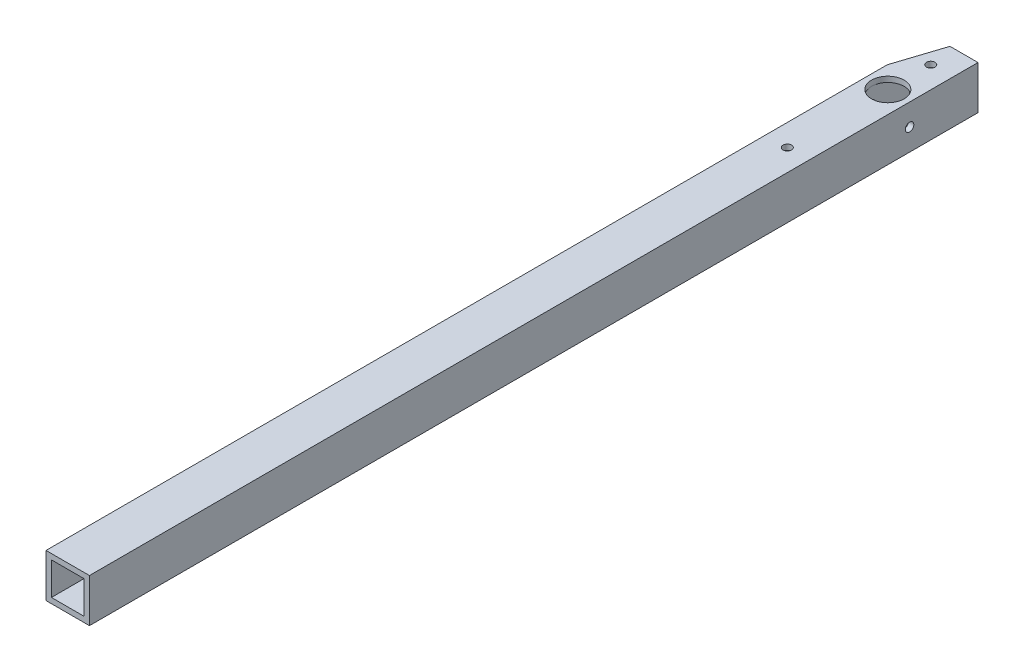
ISO-10303-21;
HEADER;
FILE_DESCRIPTION(('STEP AP214'),'2;1');
FILE_NAME('part.step','',(''),(''),'','','');
FILE_SCHEMA(('AUTOMOTIVE_DESIGN { 1 0 10303 214 1 1 1 1 }'));
ENDSEC;
DATA;
#1=APPLICATION_CONTEXT('core data for automotive mechanical design processes');
#2=APPLICATION_PROTOCOL_DEFINITION('international standard','automotive_design',2000,#1);
#3=PRODUCT_CONTEXT('',#1,'mechanical');
#4=PRODUCT('Part','Part','',(#3));
#5=PRODUCT_RELATED_PRODUCT_CATEGORY('part','',(#4));
#6=PRODUCT_DEFINITION_FORMATION('','',#4);
#7=PRODUCT_DEFINITION_CONTEXT('part definition',#1,'design');
#8=PRODUCT_DEFINITION('design','',#6,#7);
#9=PRODUCT_DEFINITION_SHAPE('','',#8);
#10=(LENGTH_UNIT() NAMED_UNIT(*) SI_UNIT(.MILLI.,.METRE.));
#11=(NAMED_UNIT(*) PLANE_ANGLE_UNIT() SI_UNIT($,.RADIAN.));
#12=(NAMED_UNIT(*) SI_UNIT($,.STERADIAN.) SOLID_ANGLE_UNIT());
#13=UNCERTAINTY_MEASURE_WITH_UNIT(LENGTH_MEASURE(1.E-05),#10,'distance_accuracy_value','');
#14=(GEOMETRIC_REPRESENTATION_CONTEXT(3) GLOBAL_UNCERTAINTY_ASSIGNED_CONTEXT((#13)) GLOBAL_UNIT_ASSIGNED_CONTEXT((#10,
#11,#12)) REPRESENTATION_CONTEXT('',''));
#15=CARTESIAN_POINT('',(0.,0.,0.));
#16=DIRECTION('',(0.,0.,1.));
#17=DIRECTION('',(1.,0.,0.));
#18=AXIS2_PLACEMENT_3D('',#15,#16,#17);
#19=CARTESIAN_POINT('',(-9.525,-9.525,266.7));
#20=DIRECTION('',(0.,1.,0.));
#21=DIRECTION('',(0.,0.,1.));
#22=AXIS2_PLACEMENT_3D('',#19,#20,#21);
#23=PLANE('',#22);
#24=CARTESIAN_POINT('',(-3.16240089670572E-12,-9.525,-237.806480142151));
#25=DIRECTION('',(0.,1.,0.));
#26=DIRECTION('',(0.,0.,1.));
#27=AXIS2_PLACEMENT_3D('',#24,#25,#26);
#28=CIRCLE('',#27,2.48919999999999);
#29=CARTESIAN_POINT('',(-3.16240089670572E-12,-9.525,-235.317280142151));
#30=VERTEX_POINT('',#29);
#31=EDGE_CURVE('E264',#30,#30,#28,.T.);
#32=ORIENTED_EDGE('',*,*,#31,.F.);
#33=EDGE_LOOP('',(#32));
#34=FACE_BOUND('',#33,.T.);
#35=DIRECTION('',(0.309016994375063,0.,-0.951056516295116));
#36=VECTOR('',#35,1.);
#37=CARTESIAN_POINT('',(-156.9077726563,-9.525,218.812434278532));
#38=LINE('',#37,#36);
#39=CARTESIAN_POINT('',(-9.525,-9.525,-234.785098788817));
#40=VERTEX_POINT('',#39);
#41=CARTESIAN_POINT('',(-3.69434814953062,-9.525,-252.73));
#42=VERTEX_POINT('',#41);
#43=EDGE_CURVE('E202',#40,#42,#38,.T.);
#44=ORIENTED_EDGE('',*,*,#43,.F.);
#45=DIRECTION('',(0.,0.,-1.));
#46=VECTOR('',#45,1.);
#47=CARTESIAN_POINT('',(-9.525,-9.525,266.7));
#48=LINE('',#47,#46);
#49=CARTESIAN_POINT('',(-9.525,-9.525,-212.725));
#50=VERTEX_POINT('',#49);
#51=EDGE_CURVE('E161',#50,#40,#48,.T.);
#52=ORIENTED_EDGE('',*,*,#51,.F.);
#53=CARTESIAN_POINT('',(0.,-9.525,-212.725));
#54=DIRECTION('',(0.,1.,0.));
#55=DIRECTION('',(0.,0.,1.));
#56=AXIS2_PLACEMENT_3D('',#53,#54,#55);
#57=CIRCLE('',#56,9.525);
#58=CARTESIAN_POINT('',(9.525,-9.525,-212.725));
#59=VERTEX_POINT('',#58);
#60=EDGE_CURVE('E214',#59,#50,#57,.T.);
#61=ORIENTED_EDGE('',*,*,#60,.F.);
#62=DIRECTION('',(0.,0.,-1.));
#63=VECTOR('',#62,1.);
#64=CARTESIAN_POINT('',(9.52500000000001,-9.525,266.7));
#65=LINE('',#64,#63);
#66=CARTESIAN_POINT('',(9.52500000000001,-9.525,-252.73));
#67=VERTEX_POINT('',#66);
#68=EDGE_CURVE('E174',#59,#67,#65,.T.);
#69=ORIENTED_EDGE('',*,*,#68,.T.);
#70=DIRECTION('',(1.,0.,0.));
#71=VECTOR('',#70,1.);
#72=CARTESIAN_POINT('',(-9.525,-9.525,-252.73));
#73=LINE('',#72,#71);
#74=EDGE_CURVE('E208',#42,#67,#73,.T.);
#75=ORIENTED_EDGE('',*,*,#74,.F.);
#76=EDGE_LOOP('',(#44,#52,#61,#69,#75));
#77=FACE_BOUND('',#76,.T.);
#78=ADVANCED_FACE('F42',(#34,#77),#23,.T.);
#79=CARTESIAN_POINT('',(9.525,9.525,266.7));
#80=DIRECTION('',(0.,-1.,0.));
#81=DIRECTION('',(0.,0.,-1.));
#82=AXIS2_PLACEMENT_3D('',#79,#80,#81);
#83=PLANE('',#82);
#84=CARTESIAN_POINT('',(-2.96811186739632E-12,9.525,-153.959960070108));
#85=DIRECTION('',(0.,-1.,0.));
#86=DIRECTION('',(0.,0.,-1.));
#87=AXIS2_PLACEMENT_3D('',#84,#85,#86);
#88=CIRCLE('',#87,2.48919999999999);
#89=CARTESIAN_POINT('',(-2.96811186739632E-12,9.525,-156.449160070108));
#90=VERTEX_POINT('',#89);
#91=EDGE_CURVE('E280',#90,#90,#88,.T.);
#92=ORIENTED_EDGE('',*,*,#91,.F.);
#93=EDGE_LOOP('',(#92));
#94=FACE_BOUND('',#93,.T.);
#95=CARTESIAN_POINT('',(0.,9.525,-212.725));
#96=DIRECTION('',(0.,-1.,0.));
#97=DIRECTION('',(0.,0.,-1.));
#98=AXIS2_PLACEMENT_3D('',#95,#96,#97);
#99=CIRCLE('',#98,9.525);
#100=CARTESIAN_POINT('',(9.525,9.525,-212.725));
#101=VERTEX_POINT('',#100);
#102=CARTESIAN_POINT('',(-9.52500000000001,9.525,-212.725));
#103=VERTEX_POINT('',#102);
#104=EDGE_CURVE('E339',#101,#103,#99,.T.);
#105=ORIENTED_EDGE('',*,*,#104,.F.);
#106=DIRECTION('',(0.,0.,-1.));
#107=VECTOR('',#106,1.);
#108=CARTESIAN_POINT('',(9.525,9.525,266.7));
#109=LINE('',#108,#107);
#110=CARTESIAN_POINT('',(9.525,9.525,266.7));
#111=VERTEX_POINT('',#110);
#112=EDGE_CURVE('E178',#111,#101,#109,.T.);
#113=ORIENTED_EDGE('',*,*,#112,.F.);
#114=DIRECTION('',(-1.,0.,0.));
#115=VECTOR('',#114,1.);
#116=CARTESIAN_POINT('',(9.525,9.525,266.7));
#117=LINE('',#116,#115);
#118=CARTESIAN_POINT('',(-9.52500000000001,9.525,266.7));
#119=VERTEX_POINT('',#118);
#120=EDGE_CURVE('E189',#111,#119,#117,.T.);
#121=ORIENTED_EDGE('',*,*,#120,.T.);
#122=DIRECTION('',(0.,0.,-1.));
#123=VECTOR('',#122,1.);
#124=CARTESIAN_POINT('',(-9.52500000000001,9.525,266.7));
#125=LINE('',#124,#123);
#126=EDGE_CURVE('E184',#119,#103,#125,.T.);
#127=ORIENTED_EDGE('',*,*,#126,.T.);
#128=EDGE_LOOP('',(#105,#113,#121,#127));
#129=FACE_BOUND('',#128,.T.);
#130=ADVANCED_FACE('F376',(#94,#129),#83,.T.);
#131=CARTESIAN_POINT('',(0.,0.,266.7));
#132=DIRECTION('',(0.,0.,1.));
#133=DIRECTION('',(1.,0.,0.));
#134=AXIS2_PLACEMENT_3D('',#131,#132,#133);
#135=PLANE('',#134);
#136=DIRECTION('',(0.,-1.,0.));
#137=VECTOR('',#136,1.);
#138=CARTESIAN_POINT('',(-12.7,12.7,266.7));
#139=LINE('',#138,#137);
#140=CARTESIAN_POINT('',(-12.7,12.7,266.7));
#141=VERTEX_POINT('',#140);
#142=CARTESIAN_POINT('',(-12.7,-12.7,266.7));
#143=VERTEX_POINT('',#142);
#144=EDGE_CURVE('E168',#141,#143,#139,.T.);
#145=ORIENTED_EDGE('',*,*,#144,.T.);
#146=DIRECTION('',(1.,0.,0.));
#147=VECTOR('',#146,1.);
#148=CARTESIAN_POINT('',(-12.7,-12.7,266.7));
#149=LINE('',#148,#147);
#150=CARTESIAN_POINT('',(12.7,-12.7,266.7));
#151=VERTEX_POINT('',#150);
#152=EDGE_CURVE('E395',#143,#151,#149,.T.);
#153=ORIENTED_EDGE('',*,*,#152,.T.);
#154=DIRECTION('',(0.,1.,0.));
#155=VECTOR('',#154,1.);
#156=CARTESIAN_POINT('',(12.7,-12.7,266.7));
#157=LINE('',#156,#155);
#158=CARTESIAN_POINT('',(12.7,12.7,266.7));
#159=VERTEX_POINT('',#158);
#160=EDGE_CURVE('E323',#151,#159,#157,.T.);
#161=ORIENTED_EDGE('',*,*,#160,.T.);
#162=DIRECTION('',(-1.,0.,0.));
#163=VECTOR('',#162,1.);
#164=CARTESIAN_POINT('',(12.7,12.7,266.7));
#165=LINE('',#164,#163);
#166=EDGE_CURVE('E401',#159,#141,#165,.T.);
#167=ORIENTED_EDGE('',*,*,#166,.T.);
#168=EDGE_LOOP('',(#145,#153,#161,#167));
#169=FACE_BOUND('',#168,.T.);
#170=DIRECTION('',(1.,0.,0.));
#171=VECTOR('',#170,1.);
#172=CARTESIAN_POINT('',(-9.525,-9.525,266.7));
#173=LINE('',#172,#171);
#174=CARTESIAN_POINT('',(-9.525,-9.525,266.7));
#175=VERTEX_POINT('',#174);
#176=CARTESIAN_POINT('',(9.52500000000001,-9.525,266.7));
#177=VERTEX_POINT('',#176);
#178=EDGE_CURVE('E196',#175,#177,#173,.T.);
#179=ORIENTED_EDGE('',*,*,#178,.F.);
#180=DIRECTION('',(0.,-1.,0.));
#181=VECTOR('',#180,1.);
#182=CARTESIAN_POINT('',(-9.52500000000001,9.525,266.7));
#183=LINE('',#182,#181);
#184=EDGE_CURVE('E199',#119,#175,#183,.T.);
#185=ORIENTED_EDGE('',*,*,#184,.F.);
#186=ORIENTED_EDGE('',*,*,#120,.F.);
#187=DIRECTION('',(0.,1.,0.));
#188=VECTOR('',#187,1.);
#189=CARTESIAN_POINT('',(9.52500000000001,-9.525,266.7));
#190=LINE('',#189,#188);
#191=EDGE_CURVE('E192',#177,#111,#190,.T.);
#192=ORIENTED_EDGE('',*,*,#191,.F.);
#193=EDGE_LOOP('',(#179,#185,#186,#192));
#194=FACE_BOUND('',#193,.T.);
#195=ADVANCED_FACE('F410',(#169,#194),#135,.T.);
#196=CARTESIAN_POINT('',(-12.7,12.7,266.7));
#197=DIRECTION('',(1.,0.,0.));
#198=DIRECTION('',(0.,0.,-1.));
#199=AXIS2_PLACEMENT_3D('',#196,#197,#198);
#200=PLANE('',#199);
#201=CARTESIAN_POINT('',(-12.7,0.,-212.725));
#202=DIRECTION('',(1.,0.,0.));
#203=DIRECTION('',(0.,0.,-1.));
#204=AXIS2_PLACEMENT_3D('',#201,#202,#203);
#205=CIRCLE('',#204,2.4892);
#206=CARTESIAN_POINT('',(-12.7,0.,-215.2142));
#207=VERTEX_POINT('',#206);
#208=EDGE_CURVE('E256',#207,#207,#205,.T.);
#209=ORIENTED_EDGE('',*,*,#208,.T.);
#210=EDGE_LOOP('',(#209));
#211=FACE_BOUND('',#210,.T.);
#212=DIRECTION('',(0.,0.,-1.));
#213=VECTOR('',#212,1.);
#214=CARTESIAN_POINT('',(-12.7,12.7,266.7));
#215=LINE('',#214,#213);
#216=CARTESIAN_POINT('',(-12.7,12.7,-225.01345355829));
#217=VERTEX_POINT('',#216);
#218=EDGE_CURVE('E333',#141,#217,#215,.T.);
#219=ORIENTED_EDGE('',*,*,#218,.T.);
#220=DIRECTION('',(0.,1.,0.));
#221=VECTOR('',#220,1.);
#222=CARTESIAN_POINT('',(-12.7,-12.7,-225.01345355829));
#223=LINE('',#222,#221);
#224=CARTESIAN_POINT('',(-12.7,-12.7,-225.01345355829));
#225=VERTEX_POINT('',#224);
#226=EDGE_CURVE('E217',#225,#217,#223,.T.);
#227=ORIENTED_EDGE('',*,*,#226,.F.);
#228=DIRECTION('',(0.,0.,-1.));
#229=VECTOR('',#228,1.);
#230=CARTESIAN_POINT('',(-12.7,-12.7,266.7));
#231=LINE('',#230,#229);
#232=EDGE_CURVE('E326',#143,#225,#231,.T.);
#233=ORIENTED_EDGE('',*,*,#232,.F.);
#234=ORIENTED_EDGE('',*,*,#144,.F.);
#235=EDGE_LOOP('',(#219,#227,#233,#234));
#236=FACE_BOUND('',#235,.T.);
#237=ADVANCED_FACE('F44',(#211,#236),#200,.F.);
#238=CARTESIAN_POINT('',(-12.7,-12.7,266.7));
#239=DIRECTION('',(0.,1.,0.));
#240=DIRECTION('',(-1.,0.,0.));
#241=AXIS2_PLACEMENT_3D('',#238,#239,#240);
#242=PLANE('',#241);
#243=CARTESIAN_POINT('',(-2.96811186739632E-12,-12.7,-153.959960070108));
#244=DIRECTION('',(0.,1.,0.));
#245=DIRECTION('',(0.,0.,1.));
#246=AXIS2_PLACEMENT_3D('',#243,#244,#245);
#247=CIRCLE('',#246,2.4892);
#248=CARTESIAN_POINT('',(-2.96811186739632E-12,-12.7,-151.470760070108));
#249=VERTEX_POINT('',#248);
#250=EDGE_CURVE('E288',#249,#249,#247,.T.);
#251=ORIENTED_EDGE('',*,*,#250,.T.);
#252=EDGE_LOOP('',(#251));
#253=FACE_BOUND('',#252,.T.);
#254=CARTESIAN_POINT('',(-3.16240089670572E-12,-12.7,-237.806480142151));
#255=DIRECTION('',(0.,1.,0.));
#256=DIRECTION('',(0.,0.,1.));
#257=AXIS2_PLACEMENT_3D('',#254,#255,#256);
#258=CIRCLE('',#257,2.4892);
#259=CARTESIAN_POINT('',(-3.16240089670572E-12,-12.7,-235.317280142151));
#260=VERTEX_POINT('',#259);
#261=EDGE_CURVE('E272',#260,#260,#258,.T.);
#262=ORIENTED_EDGE('',*,*,#261,.T.);
#263=EDGE_LOOP('',(#262));
#264=FACE_BOUND('',#263,.T.);
#265=CARTESIAN_POINT('',(-0.660548483655789,-12.7,-179.870948658286));
#266=DIRECTION('',(0.,-1.,0.));
#267=DIRECTION('',(1.,0.,0.));
#268=AXIS2_PLACEMENT_3D('',#265,#266,#267);
#269=CIRCLE('',#268,9.525);
#270=CARTESIAN_POINT('',(8.86445151634421,-12.7,-179.870948658286));
#271=VERTEX_POINT('',#270);
#272=EDGE_CURVE('E149',#271,#271,#269,.T.);
#273=ORIENTED_EDGE('',*,*,#272,.F.);
#274=EDGE_LOOP('',(#273));
#275=FACE_BOUND('',#274,.T.);
#276=CARTESIAN_POINT('',(0.,-12.7,-212.725));
#277=DIRECTION('',(0.,1.,0.));
#278=DIRECTION('',(-1.,0.,0.));
#279=AXIS2_PLACEMENT_3D('',#276,#277,#278);
#280=CIRCLE('',#279,9.525);
#281=CARTESIAN_POINT('',(-9.52499999999999,-12.7,-212.725));
#282=VERTEX_POINT('',#281);
#283=EDGE_CURVE('E148',#282,#282,#280,.T.);
#284=ORIENTED_EDGE('',*,*,#283,.T.);
#285=EDGE_LOOP('',(#284));
#286=FACE_BOUND('',#285,.T.);
#287=ORIENTED_EDGE('',*,*,#232,.T.);
#288=DIRECTION('',(0.309016994375063,0.,-0.951056516295116));
#289=VECTOR('',#288,1.);
#290=CARTESIAN_POINT('',(-3.69434814953062,-12.7,-252.73));
#291=LINE('',#290,#289);
#292=CARTESIAN_POINT('',(-3.69434814953062,-12.7,-252.73));
#293=VERTEX_POINT('',#292);
#294=EDGE_CURVE('E239',#225,#293,#291,.T.);
#295=ORIENTED_EDGE('',*,*,#294,.T.);
#296=DIRECTION('',(1.,0.,0.));
#297=VECTOR('',#296,1.);
#298=CARTESIAN_POINT('',(12.7,-12.7,-252.73));
#299=LINE('',#298,#297);
#300=CARTESIAN_POINT('',(12.7,-12.7,-252.73));
#301=VERTEX_POINT('',#300);
#302=EDGE_CURVE('E242',#293,#301,#299,.T.);
#303=ORIENTED_EDGE('',*,*,#302,.T.);
#304=DIRECTION('',(0.,0.,-1.));
#305=VECTOR('',#304,1.);
#306=CARTESIAN_POINT('',(12.7,-12.7,266.7));
#307=LINE('',#306,#305);
#308=EDGE_CURVE('E322',#151,#301,#307,.T.);
#309=ORIENTED_EDGE('',*,*,#308,.F.);
#310=ORIENTED_EDGE('',*,*,#152,.F.);
#311=EDGE_LOOP('',(#287,#295,#303,#309,#310));
#312=FACE_BOUND('',#311,.T.);
#313=ADVANCED_FACE('F391',(#253,#264,#275,#286,#312),#242,.F.);
#314=CARTESIAN_POINT('',(12.7,-12.7,266.7));
#315=DIRECTION('',(-1.,0.,0.));
#316=DIRECTION('',(0.,0.,1.));
#317=AXIS2_PLACEMENT_3D('',#314,#315,#316);
#318=PLANE('',#317);
#319=CARTESIAN_POINT('',(12.7,0.,-212.725));
#320=DIRECTION('',(1.,0.,0.));
#321=DIRECTION('',(0.,0.,-1.));
#322=AXIS2_PLACEMENT_3D('',#319,#320,#321);
#323=CIRCLE('',#322,2.48919999999999);
#324=CARTESIAN_POINT('',(12.7,0.,-215.2142));
#325=VERTEX_POINT('',#324);
#326=EDGE_CURVE('E260',#325,#325,#323,.T.);
#327=ORIENTED_EDGE('',*,*,#326,.F.);
#328=EDGE_LOOP('',(#327));
#329=FACE_BOUND('',#328,.T.);
#330=ORIENTED_EDGE('',*,*,#308,.T.);
#331=DIRECTION('',(0.,1.,0.));
#332=VECTOR('',#331,1.);
#333=CARTESIAN_POINT('',(12.7,-12.7,-252.73));
#334=LINE('',#333,#332);
#335=CARTESIAN_POINT('',(12.7,12.7,-252.73));
#336=VERTEX_POINT('',#335);
#337=EDGE_CURVE('E229',#301,#336,#334,.T.);
#338=ORIENTED_EDGE('',*,*,#337,.T.);
#339=DIRECTION('',(0.,0.,-1.));
#340=VECTOR('',#339,1.);
#341=CARTESIAN_POINT('',(12.7,12.7,266.7));
#342=LINE('',#341,#340);
#343=EDGE_CURVE('E314',#159,#336,#342,.T.);
#344=ORIENTED_EDGE('',*,*,#343,.F.);
#345=ORIENTED_EDGE('',*,*,#160,.F.);
#346=EDGE_LOOP('',(#330,#338,#344,#345));
#347=FACE_BOUND('',#346,.T.);
#348=ADVANCED_FACE('F302',(#329,#347),#318,.F.);
#349=CARTESIAN_POINT('',(12.7,12.7,266.7));
#350=DIRECTION('',(0.,-1.,0.));
#351=DIRECTION('',(1.,0.,0.));
#352=AXIS2_PLACEMENT_3D('',#349,#350,#351);
#353=PLANE('',#352);
#354=CARTESIAN_POINT('',(-2.96811186739632E-12,12.7,-153.959960070108));
#355=DIRECTION('',(0.,1.,0.));
#356=DIRECTION('',(0.,0.,1.));
#357=AXIS2_PLACEMENT_3D('',#354,#355,#356);
#358=CIRCLE('',#357,2.48919999999999);
#359=CARTESIAN_POINT('',(-2.96811186739632E-12,12.7,-151.470760070108));
#360=VERTEX_POINT('',#359);
#361=EDGE_CURVE('E292',#360,#360,#358,.T.);
#362=ORIENTED_EDGE('',*,*,#361,.F.);
#363=EDGE_LOOP('',(#362));
#364=FACE_BOUND('',#363,.T.);
#365=CARTESIAN_POINT('',(-3.16240089670572E-12,12.7,-237.806480142151));
#366=DIRECTION('',(0.,1.,0.));
#367=DIRECTION('',(0.,0.,1.));
#368=AXIS2_PLACEMENT_3D('',#365,#366,#367);
#369=CIRCLE('',#368,2.48919999999999);
#370=CARTESIAN_POINT('',(-3.16240089670572E-12,12.7,-235.317280142151));
#371=VERTEX_POINT('',#370);
#372=EDGE_CURVE('E276',#371,#371,#369,.T.);
#373=ORIENTED_EDGE('',*,*,#372,.F.);
#374=EDGE_LOOP('',(#373));
#375=FACE_BOUND('',#374,.T.);
#376=CARTESIAN_POINT('',(0.,12.7,-212.725));
#377=DIRECTION('',(0.,1.,0.));
#378=DIRECTION('',(-1.,0.,0.));
#379=AXIS2_PLACEMENT_3D('',#376,#377,#378);
#380=CIRCLE('',#379,9.525);
#381=CARTESIAN_POINT('',(-9.52499999999999,12.7,-212.725));
#382=VERTEX_POINT('',#381);
#383=EDGE_CURVE('E221',#382,#382,#380,.T.);
#384=ORIENTED_EDGE('',*,*,#383,.F.);
#385=EDGE_LOOP('',(#384));
#386=FACE_BOUND('',#385,.T.);
#387=DIRECTION('',(1.,0.,0.));
#388=VECTOR('',#387,1.);
#389=CARTESIAN_POINT('',(12.7,12.7,-252.73));
#390=LINE('',#389,#388);
#391=CARTESIAN_POINT('',(-3.69434814953062,12.7,-252.73));
#392=VERTEX_POINT('',#391);
#393=EDGE_CURVE('E236',#392,#336,#390,.T.);
#394=ORIENTED_EDGE('',*,*,#393,.F.);
#395=DIRECTION('',(0.309016994375063,0.,-0.951056516295116));
#396=VECTOR('',#395,1.);
#397=CARTESIAN_POINT('',(-3.69434814953062,12.7,-252.73));
#398=LINE('',#397,#396);
#399=EDGE_CURVE('E65',#217,#392,#398,.T.);
#400=ORIENTED_EDGE('',*,*,#399,.F.);
#401=ORIENTED_EDGE('',*,*,#218,.F.);
#402=ORIENTED_EDGE('',*,*,#166,.F.);
#403=ORIENTED_EDGE('',*,*,#343,.T.);
#404=EDGE_LOOP('',(#394,#400,#401,#402,#403));
#405=FACE_BOUND('',#404,.T.);
#406=ADVANCED_FACE('F299',(#364,#375,#386,#405),#353,.F.);
#407=CARTESIAN_POINT('',(-9.52500000000001,9.525,266.7));
#408=DIRECTION('',(1.,0.,0.));
#409=DIRECTION('',(0.,1.,0.));
#410=AXIS2_PLACEMENT_3D('',#407,#408,#409);
#411=PLANE('',#410);
#412=CARTESIAN_POINT('',(-9.525,0.,-212.725));
#413=DIRECTION('',(1.,0.,0.));
#414=DIRECTION('',(0.,1.,0.));
#415=AXIS2_PLACEMENT_3D('',#412,#413,#414);
#416=CIRCLE('',#415,2.48919999999999);
#417=CARTESIAN_POINT('',(-9.525,2.48919999999999,-212.725));
#418=VERTEX_POINT('',#417);
#419=EDGE_CURVE('E251',#418,#418,#416,.T.);
#420=ORIENTED_EDGE('',*,*,#419,.F.);
#421=EDGE_LOOP('',(#420));
#422=FACE_BOUND('',#421,.T.);
#423=DIRECTION('',(0.,-1.,0.));
#424=VECTOR('',#423,1.);
#425=CARTESIAN_POINT('',(-9.52500000000001,9.52500000000049,-234.785098788817));
#426=LINE('',#425,#424);
#427=CARTESIAN_POINT('',(-9.52500000000001,9.525,-234.785098788818));
#428=VERTEX_POINT('',#427);
#429=EDGE_CURVE('E205',#428,#40,#426,.T.);
#430=ORIENTED_EDGE('',*,*,#429,.F.);
#431=EDGE_CURVE('E188',#103,#428,#125,.T.);
#432=ORIENTED_EDGE('',*,*,#431,.F.);
#433=ORIENTED_EDGE('',*,*,#126,.F.);
#434=ORIENTED_EDGE('',*,*,#184,.T.);
#435=CARTESIAN_POINT('',(-9.525,-9.525,-176.385676170462));
#436=VERTEX_POINT('',#435);
#437=EDGE_CURVE('E163',#175,#436,#48,.T.);
#438=ORIENTED_EDGE('',*,*,#437,.T.);
#439=CARTESIAN_POINT('',(-9.525,-9.525,-183.35622114611));
#440=VERTEX_POINT('',#439);
#441=EDGE_CURVE('E146',#436,#440,#48,.T.);
#442=ORIENTED_EDGE('',*,*,#441,.T.);
#443=EDGE_CURVE('E152',#440,#50,#48,.T.);
#444=ORIENTED_EDGE('',*,*,#443,.T.);
#445=ORIENTED_EDGE('',*,*,#51,.T.);
#446=EDGE_LOOP('',(#430,#432,#433,#434,#438,#442,#444,#445));
#447=FACE_BOUND('',#446,.T.);
#448=ADVANCED_FACE('F165',(#422,#447),#411,.T.);
#449=CARTESIAN_POINT('',(-2.96811186739632E-12,-9.525,-153.959960070108));
#450=DIRECTION('',(0.,1.,0.));
#451=DIRECTION('',(0.,0.,1.));
#452=AXIS2_PLACEMENT_3D('',#449,#450,#451);
#453=CIRCLE('',#452,2.48919999999999);
#454=CARTESIAN_POINT('',(-2.96811186739632E-12,-9.525,-151.470760070108));
#455=VERTEX_POINT('',#454);
#456=EDGE_CURVE('E284',#455,#455,#453,.T.);
#457=ORIENTED_EDGE('',*,*,#456,.F.);
#458=EDGE_LOOP('',(#457));
#459=FACE_BOUND('',#458,.T.);
#460=CARTESIAN_POINT('',(-0.66054848365579,-9.525,-179.870948658286));
#461=DIRECTION('',(0.,1.,0.));
#462=DIRECTION('',(0.,0.,1.));
#463=AXIS2_PLACEMENT_3D('',#460,#461,#462);
#464=CIRCLE('',#463,9.525);
#465=EDGE_CURVE('E11',#436,#440,#464,.T.);
#466=ORIENTED_EDGE('',*,*,#465,.F.);
#467=ORIENTED_EDGE('',*,*,#437,.F.);
#468=ORIENTED_EDGE('',*,*,#178,.T.);
#469=EDGE_CURVE('E172',#177,#59,#65,.T.);
#470=ORIENTED_EDGE('',*,*,#469,.T.);
#471=EDGE_CURVE('E155',#50,#59,#57,.T.);
#472=ORIENTED_EDGE('',*,*,#471,.F.);
#473=ORIENTED_EDGE('',*,*,#443,.F.);
#474=EDGE_LOOP('',(#466,#467,#468,#470,#472,#473));
#475=FACE_BOUND('',#474,.T.);
#476=ADVANCED_FACE('F153',(#459,#475),#23,.T.);
#477=CARTESIAN_POINT('',(9.52500000000001,-9.525,266.7));
#478=DIRECTION('',(-1.,0.,0.));
#479=DIRECTION('',(0.,-1.,0.));
#480=AXIS2_PLACEMENT_3D('',#477,#478,#479);
#481=PLANE('',#480);
#482=CARTESIAN_POINT('',(9.525,0.,-212.725));
#483=DIRECTION('',(-1.,0.,0.));
#484=DIRECTION('',(0.,-1.,0.));
#485=AXIS2_PLACEMENT_3D('',#482,#483,#484);
#486=CIRCLE('',#485,2.48919999999999);
#487=CARTESIAN_POINT('',(9.525,-2.4892,-212.725));
#488=VERTEX_POINT('',#487);
#489=EDGE_CURVE('E46',#488,#488,#486,.T.);
#490=ORIENTED_EDGE('',*,*,#489,.F.);
#491=EDGE_LOOP('',(#490));
#492=FACE_BOUND('',#491,.T.);
#493=ORIENTED_EDGE('',*,*,#112,.T.);
#494=CARTESIAN_POINT('',(9.525,9.525,-252.73));
#495=VERTEX_POINT('',#494);
#496=EDGE_CURVE('E183',#101,#495,#109,.T.);
#497=ORIENTED_EDGE('',*,*,#496,.T.);
#498=DIRECTION('',(0.,1.,0.));
#499=VECTOR('',#498,1.);
#500=CARTESIAN_POINT('',(9.52500000000001,-9.525,-252.73));
#501=LINE('',#500,#499);
#502=EDGE_CURVE('E211',#67,#495,#501,.T.);
#503=ORIENTED_EDGE('',*,*,#502,.F.);
#504=ORIENTED_EDGE('',*,*,#68,.F.);
#505=ORIENTED_EDGE('',*,*,#469,.F.);
#506=ORIENTED_EDGE('',*,*,#191,.T.);
#507=EDGE_LOOP('',(#493,#497,#503,#504,#505,#506));
#508=FACE_BOUND('',#507,.T.);
#509=ADVANCED_FACE('F366',(#492,#508),#481,.T.);
#510=CARTESIAN_POINT('',(-3.16240089670572E-12,9.525,-237.806480142151));
#511=DIRECTION('',(0.,-1.,0.));
#512=DIRECTION('',(0.,0.,-1.));
#513=AXIS2_PLACEMENT_3D('',#510,#511,#512);
#514=CIRCLE('',#513,2.48919999999999);
#515=CARTESIAN_POINT('',(-3.16240089670572E-12,9.525,-240.295680142151));
#516=VERTEX_POINT('',#515);
#517=EDGE_CURVE('E268',#516,#516,#514,.T.);
#518=ORIENTED_EDGE('',*,*,#517,.F.);
#519=EDGE_LOOP('',(#518));
#520=FACE_BOUND('',#519,.T.);
#521=DIRECTION('',(-0.309016994375063,0.,0.951056516295116));
#522=VECTOR('',#521,1.);
#523=CARTESIAN_POINT('',(-155.08865952772,9.525,213.213779750444));
#524=LINE('',#523,#522);
#525=CARTESIAN_POINT('',(-3.69434814953062,9.525,-252.73));
#526=VERTEX_POINT('',#525);
#527=EDGE_CURVE('E52',#526,#428,#524,.T.);
#528=ORIENTED_EDGE('',*,*,#527,.F.);
#529=DIRECTION('',(-1.,0.,0.));
#530=VECTOR('',#529,1.);
#531=CARTESIAN_POINT('',(9.525,9.525,-252.73));
#532=LINE('',#531,#530);
#533=EDGE_CURVE('E340',#495,#526,#532,.T.);
#534=ORIENTED_EDGE('',*,*,#533,.F.);
#535=ORIENTED_EDGE('',*,*,#496,.F.);
#536=EDGE_CURVE('E331',#103,#101,#99,.T.);
#537=ORIENTED_EDGE('',*,*,#536,.F.);
#538=ORIENTED_EDGE('',*,*,#431,.T.);
#539=EDGE_LOOP('',(#528,#534,#535,#537,#538));
#540=FACE_BOUND('',#539,.T.);
#541=ADVANCED_FACE('F353',(#520,#540),#83,.T.);
#542=CARTESIAN_POINT('',(0.,-12.7,-212.725));
#543=DIRECTION('',(0.,1.,0.));
#544=DIRECTION('',(-1.,0.,0.));
#545=AXIS2_PLACEMENT_3D('',#542,#543,#544);
#546=CYLINDRICAL_SURFACE('',#545,9.525);
#547=ORIENTED_EDGE('',*,*,#104,.T.);
#548=ORIENTED_EDGE('',*,*,#536,.T.);
#549=EDGE_LOOP('',(#547,#548));
#550=FACE_BOUND('',#549,.T.);
#551=ORIENTED_EDGE('',*,*,#383,.T.);
#552=EDGE_LOOP('',(#551));
#553=FACE_BOUND('',#552,.T.);
#554=ADVANCED_FACE('F388',(#550,#553),#546,.F.);
#555=CARTESIAN_POINT('',(-3.69434814953062,-12.7,-252.73));
#556=DIRECTION('',(0.951056516295116,0.,0.309016994375063));
#557=DIRECTION('',(0.309016994375063,0.,-0.951056516295116));
#558=AXIS2_PLACEMENT_3D('',#555,#556,#557);
#559=PLANE('',#558);
#560=ORIENTED_EDGE('',*,*,#43,.T.);
#561=DIRECTION('',(0.,1.,0.));
#562=VECTOR('',#561,1.);
#563=CARTESIAN_POINT('',(-3.69434814953062,-12.7,-252.73));
#564=LINE('',#563,#562);
#565=EDGE_CURVE('E225',#293,#42,#564,.T.);
#566=ORIENTED_EDGE('',*,*,#565,.F.);
#567=ORIENTED_EDGE('',*,*,#294,.F.);
#568=ORIENTED_EDGE('',*,*,#226,.T.);
#569=ORIENTED_EDGE('',*,*,#399,.T.);
#570=EDGE_CURVE('E230',#526,#392,#564,.T.);
#571=ORIENTED_EDGE('',*,*,#570,.F.);
#572=ORIENTED_EDGE('',*,*,#527,.T.);
#573=ORIENTED_EDGE('',*,*,#429,.T.);
#574=EDGE_LOOP('',(#560,#566,#567,#568,#569,#571,#572,#573));
#575=FACE_BOUND('',#574,.T.);
#576=ADVANCED_FACE('F345',(#575),#559,.F.);
#577=CARTESIAN_POINT('',(12.7,-12.7,-252.73));
#578=DIRECTION('',(0.,0.,1.));
#579=DIRECTION('',(1.,0.,0.));
#580=AXIS2_PLACEMENT_3D('',#577,#578,#579);
#581=PLANE('',#580);
#582=ORIENTED_EDGE('',*,*,#74,.T.);
#583=ORIENTED_EDGE('',*,*,#502,.T.);
#584=ORIENTED_EDGE('',*,*,#533,.T.);
#585=ORIENTED_EDGE('',*,*,#570,.T.);
#586=ORIENTED_EDGE('',*,*,#393,.T.);
#587=ORIENTED_EDGE('',*,*,#337,.F.);
#588=ORIENTED_EDGE('',*,*,#302,.F.);
#589=ORIENTED_EDGE('',*,*,#565,.T.);
#590=EDGE_LOOP('',(#582,#583,#584,#585,#586,#587,#588,#589));
#591=FACE_BOUND('',#590,.T.);
#592=ADVANCED_FACE('F316',(#591),#581,.F.);
#593=ORIENTED_EDGE('',*,*,#60,.T.);
#594=ORIENTED_EDGE('',*,*,#471,.T.);
#595=EDGE_LOOP('',(#593,#594));
#596=FACE_BOUND('',#595,.T.);
#597=ORIENTED_EDGE('',*,*,#283,.F.);
#598=EDGE_LOOP('',(#597));
#599=FACE_BOUND('',#598,.T.);
#600=ADVANCED_FACE('F384',(#596,#599),#546,.F.);
#601=CARTESIAN_POINT('',(-0.66054848365579,-9.525,-179.870948658286));
#602=DIRECTION('',(0.,-1.,0.));
#603=DIRECTION('',(1.,0.,0.));
#604=AXIS2_PLACEMENT_3D('',#601,#602,#603);
#605=CYLINDRICAL_SURFACE('',#604,9.525);
#606=CARTESIAN_POINT('',(-0.66054848365579,-9.525,-179.870948658286));
#607=DIRECTION('',(0.,-1.,0.));
#608=DIRECTION('',(1.,0.,0.));
#609=AXIS2_PLACEMENT_3D('',#606,#607,#608);
#610=CIRCLE('',#609,9.525);
#611=EDGE_CURVE('E57',#436,#440,#610,.T.);
#612=ORIENTED_EDGE('',*,*,#611,.F.);
#613=ORIENTED_EDGE('',*,*,#465,.T.);
#614=EDGE_LOOP('',(#612,#613));
#615=FACE_BOUND('',#614,.T.);
#616=ORIENTED_EDGE('',*,*,#272,.T.);
#617=EDGE_LOOP('',(#616));
#618=FACE_BOUND('',#617,.T.);
#619=ADVANCED_FACE('F137',(#615,#618),#605,.F.);
#620=CARTESIAN_POINT('',(-0.66054848365579,-9.525,-179.870948658286));
#621=DIRECTION('',(0.,-1.,0.));
#622=DIRECTION('',(1.,0.,0.));
#623=AXIS2_PLACEMENT_3D('',#620,#621,#622);
#624=PLANE('',#623);
#625=ORIENTED_EDGE('',*,*,#611,.T.);
#626=ORIENTED_EDGE('',*,*,#441,.F.);
#627=EDGE_LOOP('',(#625,#626));
#628=FACE_BOUND('',#627,.T.);
#629=ADVANCED_FACE('F144',(#628),#624,.T.);
#630=CARTESIAN_POINT('',(12.7,0.,-212.725));
#631=DIRECTION('',(1.,0.,0.));
#632=DIRECTION('',(0.,0.,-1.));
#633=AXIS2_PLACEMENT_3D('',#630,#631,#632);
#634=CYLINDRICAL_SURFACE('',#633,2.48919999999999);
#635=ORIENTED_EDGE('',*,*,#489,.T.);
#636=EDGE_LOOP('',(#635));
#637=FACE_BOUND('',#636,.T.);
#638=ORIENTED_EDGE('',*,*,#326,.T.);
#639=EDGE_LOOP('',(#638));
#640=FACE_BOUND('',#639,.T.);
#641=ADVANCED_FACE('F363',(#637,#640),#634,.F.);
#642=ORIENTED_EDGE('',*,*,#419,.T.);
#643=EDGE_LOOP('',(#642));
#644=FACE_BOUND('',#643,.T.);
#645=ORIENTED_EDGE('',*,*,#208,.F.);
#646=EDGE_LOOP('',(#645));
#647=FACE_BOUND('',#646,.T.);
#648=ADVANCED_FACE('F472',(#644,#647),#634,.F.);
#649=CARTESIAN_POINT('',(-3.16240089670572E-12,12.7,-237.806480142151));
#650=DIRECTION('',(0.,1.,0.));
#651=DIRECTION('',(0.,0.,1.));
#652=AXIS2_PLACEMENT_3D('',#649,#650,#651);
#653=CYLINDRICAL_SURFACE('',#652,2.48919999999999);
#654=ORIENTED_EDGE('',*,*,#517,.T.);
#655=EDGE_LOOP('',(#654));
#656=FACE_BOUND('',#655,.T.);
#657=ORIENTED_EDGE('',*,*,#372,.T.);
#658=EDGE_LOOP('',(#657));
#659=FACE_BOUND('',#658,.T.);
#660=ADVANCED_FACE('F468',(#656,#659),#653,.F.);
#661=ORIENTED_EDGE('',*,*,#31,.T.);
#662=EDGE_LOOP('',(#661));
#663=FACE_BOUND('',#662,.T.);
#664=ORIENTED_EDGE('',*,*,#261,.F.);
#665=EDGE_LOOP('',(#664));
#666=FACE_BOUND('',#665,.T.);
#667=ADVANCED_FACE('F471',(#663,#666),#653,.F.);
#668=CARTESIAN_POINT('',(-2.96811186739632E-12,12.7,-153.959960070108));
#669=DIRECTION('',(0.,1.,0.));
#670=DIRECTION('',(0.,0.,1.));
#671=AXIS2_PLACEMENT_3D('',#668,#669,#670);
#672=CYLINDRICAL_SURFACE('',#671,2.48919999999999);
#673=ORIENTED_EDGE('',*,*,#91,.T.);
#674=EDGE_LOOP('',(#673));
#675=FACE_BOUND('',#674,.T.);
#676=ORIENTED_EDGE('',*,*,#361,.T.);
#677=EDGE_LOOP('',(#676));
#678=FACE_BOUND('',#677,.T.);
#679=ADVANCED_FACE('F297',(#675,#678),#672,.F.);
#680=ORIENTED_EDGE('',*,*,#456,.T.);
#681=EDGE_LOOP('',(#680));
#682=FACE_BOUND('',#681,.T.);
#683=ORIENTED_EDGE('',*,*,#250,.F.);
#684=EDGE_LOOP('',(#683));
#685=FACE_BOUND('',#684,.T.);
#686=ADVANCED_FACE('F441',(#682,#685),#672,.F.);
#687=CLOSED_SHELL('',(#78,#130,#195,#237,#313,#348,#406,#448,#476,#509,#541,#554,#576,#592,#600,
#619,#629,#641,#648,#660,#667,#679,#686));
#688=MANIFOLD_SOLID_BREP('B2',#687);
#689=ADVANCED_BREP_SHAPE_REPRESENTATION('',(#18,#688),#14);
#690=SHAPE_DEFINITION_REPRESENTATION(#9,#689);
ENDSEC;
END-ISO-10303-21;
